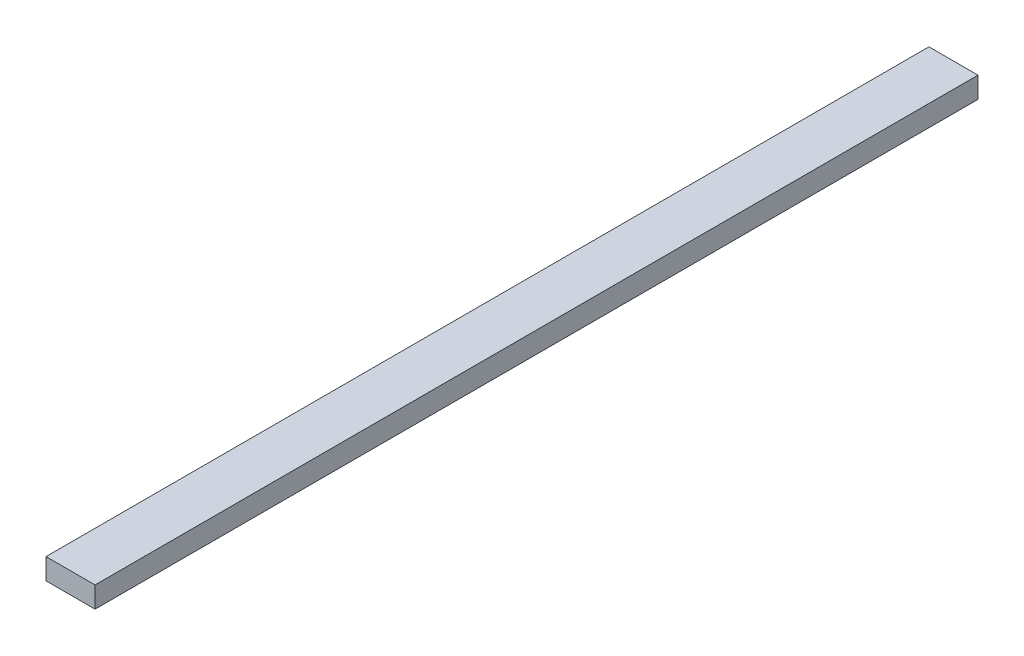
ISO-10303-21;
HEADER;
FILE_DESCRIPTION(('STEP AP214'),'2;1');
FILE_NAME('part.step','',(''),(''),'','','');
FILE_SCHEMA(('AUTOMOTIVE_DESIGN { 1 0 10303 214 1 1 1 1 }'));
ENDSEC;
DATA;
#1=APPLICATION_CONTEXT('core data for automotive mechanical design processes');
#2=APPLICATION_PROTOCOL_DEFINITION('international standard','automotive_design',2000,#1);
#3=PRODUCT_CONTEXT('',#1,'mechanical');
#4=PRODUCT('Part','Part','',(#3));
#5=PRODUCT_RELATED_PRODUCT_CATEGORY('part','',(#4));
#6=PRODUCT_DEFINITION_FORMATION('','',#4);
#7=PRODUCT_DEFINITION_CONTEXT('part definition',#1,'design');
#8=PRODUCT_DEFINITION('design','',#6,#7);
#9=PRODUCT_DEFINITION_SHAPE('','',#8);
#10=(LENGTH_UNIT() NAMED_UNIT(*) SI_UNIT(.MILLI.,.METRE.));
#11=(NAMED_UNIT(*) PLANE_ANGLE_UNIT() SI_UNIT($,.RADIAN.));
#12=(NAMED_UNIT(*) SI_UNIT($,.STERADIAN.) SOLID_ANGLE_UNIT());
#13=UNCERTAINTY_MEASURE_WITH_UNIT(LENGTH_MEASURE(1.E-05),#10,'distance_accuracy_value','');
#14=(GEOMETRIC_REPRESENTATION_CONTEXT(3) GLOBAL_UNCERTAINTY_ASSIGNED_CONTEXT((#13)) GLOBAL_UNIT_ASSIGNED_CONTEXT((#10,
#11,#12)) REPRESENTATION_CONTEXT('',''));
#15=CARTESIAN_POINT('',(0.,0.,0.));
#16=DIRECTION('',(0.,0.,1.));
#17=DIRECTION('',(1.,0.,0.));
#18=AXIS2_PLACEMENT_3D('',#15,#16,#17);
#19=CARTESIAN_POINT('',(0.,0.,1600.2));
#20=DIRECTION('',(1.,0.,0.));
#21=DIRECTION('',(0.,1.,0.));
#22=AXIS2_PLACEMENT_3D('',#19,#20,#21);
#23=PLANE('',#22);
#24=DIRECTION('',(0.,-1.,0.));
#25=VECTOR('',#24,1.);
#26=CARTESIAN_POINT('',(0.,0.,0.));
#27=LINE('',#26,#25);
#28=CARTESIAN_POINT('',(0.,0.,0.));
#29=VERTEX_POINT('',#28);
#30=CARTESIAN_POINT('',(0.,-38.1,0.));
#31=VERTEX_POINT('',#30);
#32=EDGE_CURVE('E96',#29,#31,#27,.T.);
#33=ORIENTED_EDGE('',*,*,#32,.T.);
#34=DIRECTION('',(0.,0.,-1.));
#35=VECTOR('',#34,1.);
#36=CARTESIAN_POINT('',(0.,-38.1,1600.2));
#37=LINE('',#36,#35);
#38=CARTESIAN_POINT('',(0.,-38.1,1600.2));
#39=VERTEX_POINT('',#38);
#40=EDGE_CURVE('E11',#39,#31,#37,.T.);
#41=ORIENTED_EDGE('',*,*,#40,.F.);
#42=DIRECTION('',(0.,-1.,0.));
#43=VECTOR('',#42,1.);
#44=CARTESIAN_POINT('',(0.,0.,1600.2));
#45=LINE('',#44,#43);
#46=CARTESIAN_POINT('',(0.,0.,1600.2));
#47=VERTEX_POINT('',#46);
#48=EDGE_CURVE('E84',#47,#39,#45,.T.);
#49=ORIENTED_EDGE('',*,*,#48,.F.);
#50=DIRECTION('',(0.,0.,-1.));
#51=VECTOR('',#50,1.);
#52=CARTESIAN_POINT('',(0.,0.,1600.2));
#53=LINE('',#52,#51);
#54=EDGE_CURVE('E92',#47,#29,#53,.T.);
#55=ORIENTED_EDGE('',*,*,#54,.T.);
#56=EDGE_LOOP('',(#33,#41,#49,#55));
#57=FACE_BOUND('',#56,.T.);
#58=ADVANCED_FACE('F33',(#57),#23,.F.);
#59=CARTESIAN_POINT('',(0.,-38.1,1600.2));
#60=DIRECTION('',(0.,1.,0.));
#61=DIRECTION('',(0.,0.,1.));
#62=AXIS2_PLACEMENT_3D('',#59,#60,#61);
#63=PLANE('',#62);
#64=DIRECTION('',(1.,0.,0.));
#65=VECTOR('',#64,1.);
#66=CARTESIAN_POINT('',(0.,-38.1,0.));
#67=LINE('',#66,#65);
#68=CARTESIAN_POINT('',(88.9,-38.1,0.));
#69=VERTEX_POINT('',#68);
#70=EDGE_CURVE('E88',#31,#69,#67,.T.);
#71=ORIENTED_EDGE('',*,*,#70,.T.);
#72=DIRECTION('',(0.,0.,-1.));
#73=VECTOR('',#72,1.);
#74=CARTESIAN_POINT('',(88.9,-38.1,1600.2));
#75=LINE('',#74,#73);
#76=CARTESIAN_POINT('',(88.9,-38.1,1600.2));
#77=VERTEX_POINT('',#76);
#78=EDGE_CURVE('E41',#77,#69,#75,.T.);
#79=ORIENTED_EDGE('',*,*,#78,.F.);
#80=DIRECTION('',(1.,0.,0.));
#81=VECTOR('',#80,1.);
#82=CARTESIAN_POINT('',(0.,-38.1,1600.2));
#83=LINE('',#82,#81);
#84=EDGE_CURVE('E79',#39,#77,#83,.T.);
#85=ORIENTED_EDGE('',*,*,#84,.F.);
#86=ORIENTED_EDGE('',*,*,#40,.T.);
#87=EDGE_LOOP('',(#71,#79,#85,#86));
#88=FACE_BOUND('',#87,.T.);
#89=ADVANCED_FACE('F87',(#88),#63,.F.);
#90=CARTESIAN_POINT('',(88.9,0.,1600.2));
#91=DIRECTION('',(-1.,0.,0.));
#92=DIRECTION('',(0.,0.,1.));
#93=AXIS2_PLACEMENT_3D('',#90,#91,#92);
#94=PLANE('',#93);
#95=DIRECTION('',(0.,1.,0.));
#96=VECTOR('',#95,1.);
#97=CARTESIAN_POINT('',(88.9,0.,0.));
#98=LINE('',#97,#96);
#99=CARTESIAN_POINT('',(88.9,0.,0.));
#100=VERTEX_POINT('',#99);
#101=EDGE_CURVE('E66',#69,#100,#98,.T.);
#102=ORIENTED_EDGE('',*,*,#101,.T.);
#103=DIRECTION('',(0.,0.,-1.));
#104=VECTOR('',#103,1.);
#105=CARTESIAN_POINT('',(88.9,0.,1600.2));
#106=LINE('',#105,#104);
#107=CARTESIAN_POINT('',(88.9,0.,1600.2));
#108=VERTEX_POINT('',#107);
#109=EDGE_CURVE('E89',#108,#100,#106,.T.);
#110=ORIENTED_EDGE('',*,*,#109,.F.);
#111=DIRECTION('',(0.,1.,0.));
#112=VECTOR('',#111,1.);
#113=CARTESIAN_POINT('',(88.9,0.,1600.2));
#114=LINE('',#113,#112);
#115=EDGE_CURVE('E82',#77,#108,#114,.T.);
#116=ORIENTED_EDGE('',*,*,#115,.F.);
#117=ORIENTED_EDGE('',*,*,#78,.T.);
#118=EDGE_LOOP('',(#102,#110,#116,#117));
#119=FACE_BOUND('',#118,.T.);
#120=ADVANCED_FACE('F90',(#119),#94,.F.);
#121=CARTESIAN_POINT('',(0.,0.,1600.2));
#122=DIRECTION('',(0.,-1.,0.));
#123=DIRECTION('',(0.,0.,-1.));
#124=AXIS2_PLACEMENT_3D('',#121,#122,#123);
#125=PLANE('',#124);
#126=DIRECTION('',(-1.,0.,0.));
#127=VECTOR('',#126,1.);
#128=CARTESIAN_POINT('',(0.,0.,0.));
#129=LINE('',#128,#127);
#130=EDGE_CURVE('E72',#100,#29,#129,.T.);
#131=ORIENTED_EDGE('',*,*,#130,.T.);
#132=ORIENTED_EDGE('',*,*,#54,.F.);
#133=DIRECTION('',(-1.,0.,0.));
#134=VECTOR('',#133,1.);
#135=CARTESIAN_POINT('',(0.,0.,1600.2));
#136=LINE('',#135,#134);
#137=EDGE_CURVE('E49',#108,#47,#136,.T.);
#138=ORIENTED_EDGE('',*,*,#137,.F.);
#139=ORIENTED_EDGE('',*,*,#109,.T.);
#140=EDGE_LOOP('',(#131,#132,#138,#139));
#141=FACE_BOUND('',#140,.T.);
#142=ADVANCED_FACE('F103',(#141),#125,.F.);
#143=CARTESIAN_POINT('',(0.,0.,1600.2));
#144=DIRECTION('',(0.,0.,1.));
#145=DIRECTION('',(1.,0.,0.));
#146=AXIS2_PLACEMENT_3D('',#143,#144,#145);
#147=PLANE('',#146);
#148=ORIENTED_EDGE('',*,*,#48,.T.);
#149=ORIENTED_EDGE('',*,*,#84,.T.);
#150=ORIENTED_EDGE('',*,*,#115,.T.);
#151=ORIENTED_EDGE('',*,*,#137,.T.);
#152=EDGE_LOOP('',(#148,#149,#150,#151));
#153=FACE_BOUND('',#152,.T.);
#154=ADVANCED_FACE('F80',(#153),#147,.T.);
#155=CARTESIAN_POINT('',(0.,0.,0.));
#156=DIRECTION('',(0.,0.,1.));
#157=DIRECTION('',(1.,0.,0.));
#158=AXIS2_PLACEMENT_3D('',#155,#156,#157);
#159=PLANE('',#158);
#160=ORIENTED_EDGE('',*,*,#32,.F.);
#161=ORIENTED_EDGE('',*,*,#130,.F.);
#162=ORIENTED_EDGE('',*,*,#101,.F.);
#163=ORIENTED_EDGE('',*,*,#70,.F.);
#164=EDGE_LOOP('',(#160,#161,#162,#163));
#165=FACE_BOUND('',#164,.T.);
#166=ADVANCED_FACE('F106',(#165),#159,.F.);
#167=CLOSED_SHELL('',(#58,#89,#120,#142,#154,#166));
#168=MANIFOLD_SOLID_BREP('B2',#167);
#169=ADVANCED_BREP_SHAPE_REPRESENTATION('',(#18,#168),#14);
#170=SHAPE_DEFINITION_REPRESENTATION(#9,#169);
ENDSEC;
END-ISO-10303-21;
